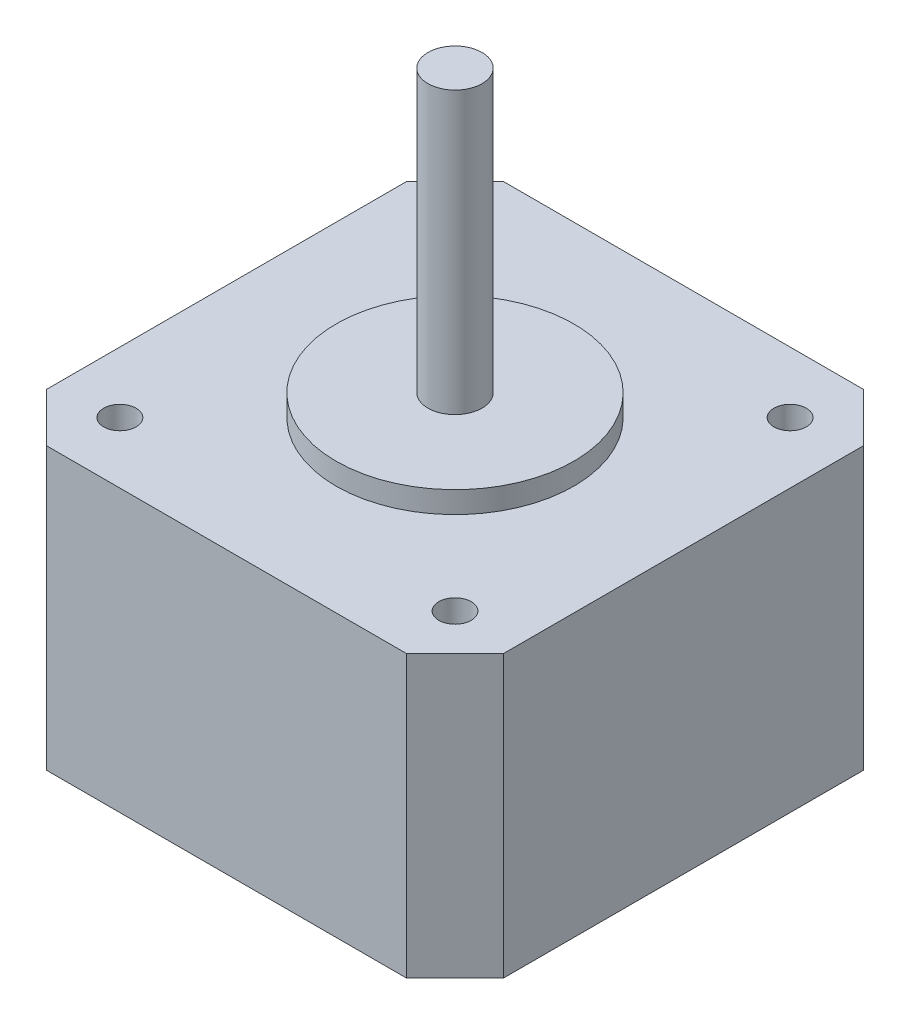
ISO-10303-21;
HEADER;
FILE_DESCRIPTION(('STEP AP214'),'2;1');
FILE_NAME('part.step','',(''),(''),'','','');
FILE_SCHEMA(('AUTOMOTIVE_DESIGN { 1 0 10303 214 1 1 1 1 }'));
ENDSEC;
DATA;
#1=APPLICATION_CONTEXT('core data for automotive mechanical design processes');
#2=APPLICATION_PROTOCOL_DEFINITION('international standard','automotive_design',2000,#1);
#3=PRODUCT_CONTEXT('',#1,'mechanical');
#4=PRODUCT('Part','Part','',(#3));
#5=PRODUCT_RELATED_PRODUCT_CATEGORY('part','',(#4));
#6=PRODUCT_DEFINITION_FORMATION('','',#4);
#7=PRODUCT_DEFINITION_CONTEXT('part definition',#1,'design');
#8=PRODUCT_DEFINITION('design','',#6,#7);
#9=PRODUCT_DEFINITION_SHAPE('','',#8);
#10=(LENGTH_UNIT() NAMED_UNIT(*) SI_UNIT(.MILLI.,.METRE.));
#11=(NAMED_UNIT(*) PLANE_ANGLE_UNIT() SI_UNIT($,.RADIAN.));
#12=(NAMED_UNIT(*) SI_UNIT($,.STERADIAN.) SOLID_ANGLE_UNIT());
#13=UNCERTAINTY_MEASURE_WITH_UNIT(LENGTH_MEASURE(1.E-05),#10,'distance_accuracy_value','');
#14=(GEOMETRIC_REPRESENTATION_CONTEXT(3) GLOBAL_UNCERTAINTY_ASSIGNED_CONTEXT((#13)) GLOBAL_UNIT_ASSIGNED_CONTEXT((#10,
#11,#12)) REPRESENTATION_CONTEXT('',''));
#15=CARTESIAN_POINT('',(0.,0.,0.));
#16=DIRECTION('',(0.,0.,1.));
#17=DIRECTION('',(1.,0.,0.));
#18=AXIS2_PLACEMENT_3D('',#15,#16,#17);
#19=CARTESIAN_POINT('',(0.,26.,-4.5));
#20=DIRECTION('',(1.,0.,0.));
#21=DIRECTION('',(0.,0.,-1.));
#22=AXIS2_PLACEMENT_3D('',#19,#20,#21);
#23=PLANE('',#22);
#24=DIRECTION('',(0.,0.,1.));
#25=VECTOR('',#24,1.);
#26=CARTESIAN_POINT('',(0.,0.,-4.5));
#27=LINE('',#26,#25);
#28=CARTESIAN_POINT('',(0.,0.,-37.8));
#29=VERTEX_POINT('',#28);
#30=CARTESIAN_POINT('',(0.,0.,-4.5));
#31=VERTEX_POINT('',#30);
#32=EDGE_CURVE('E148',#29,#31,#27,.T.);
#33=ORIENTED_EDGE('',*,*,#32,.T.);
#34=DIRECTION('',(0.,-1.,0.));
#35=VECTOR('',#34,1.);
#36=CARTESIAN_POINT('',(0.,26.,-4.5));
#37=LINE('',#36,#35);
#38=CARTESIAN_POINT('',(0.,26.,-4.5));
#39=VERTEX_POINT('',#38);
#40=EDGE_CURVE('E41',#39,#31,#37,.T.);
#41=ORIENTED_EDGE('',*,*,#40,.F.);
#42=DIRECTION('',(0.,0.,1.));
#43=VECTOR('',#42,1.);
#44=CARTESIAN_POINT('',(0.,26.,-4.5));
#45=LINE('',#44,#43);
#46=CARTESIAN_POINT('',(0.,26.,-37.8));
#47=VERTEX_POINT('',#46);
#48=EDGE_CURVE('E168',#47,#39,#45,.T.);
#49=ORIENTED_EDGE('',*,*,#48,.F.);
#50=DIRECTION('',(0.,-1.,0.));
#51=VECTOR('',#50,1.);
#52=CARTESIAN_POINT('',(0.,26.,-37.8));
#53=LINE('',#52,#51);
#54=EDGE_CURVE('E144',#47,#29,#53,.T.);
#55=ORIENTED_EDGE('',*,*,#54,.T.);
#56=EDGE_LOOP('',(#33,#41,#49,#55));
#57=FACE_BOUND('',#56,.T.);
#58=ADVANCED_FACE('F38',(#57),#23,.F.);
#59=CARTESIAN_POINT('',(0.,26.,-4.5));
#60=DIRECTION('',(0.707106781186548,0.,-0.707106781186548));
#61=DIRECTION('',(-0.707106781186548,0.,-0.707106781186548));
#62=AXIS2_PLACEMENT_3D('',#59,#60,#61);
#63=PLANE('',#62);
#64=DIRECTION('',(0.707106781186547,0.,0.707106781186547));
#65=VECTOR('',#64,1.);
#66=CARTESIAN_POINT('',(0.,0.,-4.5));
#67=LINE('',#66,#65);
#68=CARTESIAN_POINT('',(4.5,0.,0.));
#69=VERTEX_POINT('',#68);
#70=EDGE_CURVE('E152',#31,#69,#67,.T.);
#71=ORIENTED_EDGE('',*,*,#70,.T.);
#72=DIRECTION('',(0.,-1.,0.));
#73=VECTOR('',#72,1.);
#74=CARTESIAN_POINT('',(4.5,26.,0.));
#75=LINE('',#74,#73);
#76=CARTESIAN_POINT('',(4.5,26.,0.));
#77=VERTEX_POINT('',#76);
#78=EDGE_CURVE('E178',#77,#69,#75,.T.);
#79=ORIENTED_EDGE('',*,*,#78,.F.);
#80=DIRECTION('',(0.707106781186547,0.,0.707106781186547));
#81=VECTOR('',#80,1.);
#82=CARTESIAN_POINT('',(0.,26.,-4.5));
#83=LINE('',#82,#81);
#84=EDGE_CURVE('E106',#39,#77,#83,.T.);
#85=ORIENTED_EDGE('',*,*,#84,.F.);
#86=ORIENTED_EDGE('',*,*,#40,.T.);
#87=EDGE_LOOP('',(#71,#79,#85,#86));
#88=FACE_BOUND('',#87,.T.);
#89=ADVANCED_FACE('F229',(#88),#63,.F.);
#90=CARTESIAN_POINT('',(4.5,26.,0.));
#91=DIRECTION('',(0.,0.,-1.));
#92=DIRECTION('',(-1.,0.,0.));
#93=AXIS2_PLACEMENT_3D('',#90,#91,#92);
#94=PLANE('',#93);
#95=DIRECTION('',(1.,0.,0.));
#96=VECTOR('',#95,1.);
#97=CARTESIAN_POINT('',(4.5,0.,0.));
#98=LINE('',#97,#96);
#99=CARTESIAN_POINT('',(37.8,0.,0.));
#100=VERTEX_POINT('',#99);
#101=EDGE_CURVE('E156',#69,#100,#98,.T.);
#102=ORIENTED_EDGE('',*,*,#101,.T.);
#103=DIRECTION('',(0.,-1.,0.));
#104=VECTOR('',#103,1.);
#105=CARTESIAN_POINT('',(37.8,26.,0.));
#106=LINE('',#105,#104);
#107=CARTESIAN_POINT('',(37.8,26.,0.));
#108=VERTEX_POINT('',#107);
#109=EDGE_CURVE('E176',#108,#100,#106,.T.);
#110=ORIENTED_EDGE('',*,*,#109,.F.);
#111=DIRECTION('',(1.,0.,0.));
#112=VECTOR('',#111,1.);
#113=CARTESIAN_POINT('',(4.5,26.,0.));
#114=LINE('',#113,#112);
#115=EDGE_CURVE('E199',#77,#108,#114,.T.);
#116=ORIENTED_EDGE('',*,*,#115,.F.);
#117=ORIENTED_EDGE('',*,*,#78,.T.);
#118=EDGE_LOOP('',(#102,#110,#116,#117));
#119=FACE_BOUND('',#118,.T.);
#120=ADVANCED_FACE('F233',(#119),#94,.F.);
#121=CARTESIAN_POINT('',(37.8,26.,0.));
#122=DIRECTION('',(-0.707106781186548,0.,-0.707106781186547));
#123=DIRECTION('',(-0.707106781186547,0.,0.707106781186548));
#124=AXIS2_PLACEMENT_3D('',#121,#122,#123);
#125=PLANE('',#124);
#126=DIRECTION('',(0.707106781186547,0.,-0.707106781186548));
#127=VECTOR('',#126,1.);
#128=CARTESIAN_POINT('',(37.8,0.,0.));
#129=LINE('',#128,#127);
#130=CARTESIAN_POINT('',(42.3,0.,-4.5));
#131=VERTEX_POINT('',#130);
#132=EDGE_CURVE('E159',#100,#131,#129,.T.);
#133=ORIENTED_EDGE('',*,*,#132,.T.);
#134=DIRECTION('',(0.,-1.,0.));
#135=VECTOR('',#134,1.);
#136=CARTESIAN_POINT('',(42.3,26.,-4.5));
#137=LINE('',#136,#135);
#138=CARTESIAN_POINT('',(42.3,26.,-4.5));
#139=VERTEX_POINT('',#138);
#140=EDGE_CURVE('E173',#139,#131,#137,.T.);
#141=ORIENTED_EDGE('',*,*,#140,.F.);
#142=DIRECTION('',(0.707106781186547,0.,-0.707106781186548));
#143=VECTOR('',#142,1.);
#144=CARTESIAN_POINT('',(37.8,26.,0.));
#145=LINE('',#144,#143);
#146=EDGE_CURVE('E202',#108,#139,#145,.T.);
#147=ORIENTED_EDGE('',*,*,#146,.F.);
#148=ORIENTED_EDGE('',*,*,#109,.T.);
#149=EDGE_LOOP('',(#133,#141,#147,#148));
#150=FACE_BOUND('',#149,.T.);
#151=ADVANCED_FACE('F207',(#150),#125,.F.);
#152=CARTESIAN_POINT('',(42.3,26.,-4.5));
#153=DIRECTION('',(-1.,0.,0.));
#154=DIRECTION('',(0.,0.,1.));
#155=AXIS2_PLACEMENT_3D('',#152,#153,#154);
#156=PLANE('',#155);
#157=DIRECTION('',(0.,0.,-1.));
#158=VECTOR('',#157,1.);
#159=CARTESIAN_POINT('',(42.3,0.,-4.5));
#160=LINE('',#159,#158);
#161=CARTESIAN_POINT('',(42.3,0.,-37.8));
#162=VERTEX_POINT('',#161);
#163=EDGE_CURVE('E161',#131,#162,#160,.T.);
#164=ORIENTED_EDGE('',*,*,#163,.T.);
#165=DIRECTION('',(0.,-1.,0.));
#166=VECTOR('',#165,1.);
#167=CARTESIAN_POINT('',(42.3,26.,-37.8));
#168=LINE('',#167,#166);
#169=CARTESIAN_POINT('',(42.3,26.,-37.8));
#170=VERTEX_POINT('',#169);
#171=EDGE_CURVE('E135',#170,#162,#168,.T.);
#172=ORIENTED_EDGE('',*,*,#171,.F.);
#173=DIRECTION('',(0.,0.,-1.));
#174=VECTOR('',#173,1.);
#175=CARTESIAN_POINT('',(42.3,26.,-4.5));
#176=LINE('',#175,#174);
#177=EDGE_CURVE('E126',#139,#170,#176,.T.);
#178=ORIENTED_EDGE('',*,*,#177,.F.);
#179=ORIENTED_EDGE('',*,*,#140,.T.);
#180=EDGE_LOOP('',(#164,#172,#178,#179));
#181=FACE_BOUND('',#180,.T.);
#182=ADVANCED_FACE('F211',(#181),#156,.F.);
#183=CARTESIAN_POINT('',(37.8,26.,-42.3));
#184=DIRECTION('',(-0.707106781186548,0.,0.707106781186548));
#185=DIRECTION('',(0.707106781186548,0.,0.707106781186548));
#186=AXIS2_PLACEMENT_3D('',#183,#184,#185);
#187=PLANE('',#186);
#188=DIRECTION('',(-0.707106781186548,0.,-0.707106781186548));
#189=VECTOR('',#188,1.);
#190=CARTESIAN_POINT('',(37.8,0.,-42.3));
#191=LINE('',#190,#189);
#192=CARTESIAN_POINT('',(37.8,0.,-42.3));
#193=VERTEX_POINT('',#192);
#194=EDGE_CURVE('E134',#162,#193,#191,.T.);
#195=ORIENTED_EDGE('',*,*,#194,.T.);
#196=DIRECTION('',(0.,-1.,0.));
#197=VECTOR('',#196,1.);
#198=CARTESIAN_POINT('',(37.8,26.,-42.3));
#199=LINE('',#198,#197);
#200=CARTESIAN_POINT('',(37.8,26.,-42.3));
#201=VERTEX_POINT('',#200);
#202=EDGE_CURVE('E131',#201,#193,#199,.T.);
#203=ORIENTED_EDGE('',*,*,#202,.F.);
#204=DIRECTION('',(-0.707106781186548,0.,-0.707106781186548));
#205=VECTOR('',#204,1.);
#206=CARTESIAN_POINT('',(37.8,26.,-42.3));
#207=LINE('',#206,#205);
#208=EDGE_CURVE('E120',#170,#201,#207,.T.);
#209=ORIENTED_EDGE('',*,*,#208,.F.);
#210=ORIENTED_EDGE('',*,*,#171,.T.);
#211=EDGE_LOOP('',(#195,#203,#209,#210));
#212=FACE_BOUND('',#211,.T.);
#213=ADVANCED_FACE('F132',(#212),#187,.F.);
#214=CARTESIAN_POINT('',(4.5,26.,-42.3));
#215=DIRECTION('',(0.,0.,1.));
#216=DIRECTION('',(1.,0.,0.));
#217=AXIS2_PLACEMENT_3D('',#214,#215,#216);
#218=PLANE('',#217);
#219=DIRECTION('',(-1.,0.,0.));
#220=VECTOR('',#219,1.);
#221=CARTESIAN_POINT('',(4.5,0.,-42.3));
#222=LINE('',#221,#220);
#223=CARTESIAN_POINT('',(4.5,0.,-42.3));
#224=VERTEX_POINT('',#223);
#225=EDGE_CURVE('E91',#193,#224,#222,.T.);
#226=ORIENTED_EDGE('',*,*,#225,.T.);
#227=DIRECTION('',(0.,-1.,0.));
#228=VECTOR('',#227,1.);
#229=CARTESIAN_POINT('',(4.5,26.,-42.3));
#230=LINE('',#229,#228);
#231=CARTESIAN_POINT('',(4.5,26.,-42.3));
#232=VERTEX_POINT('',#231);
#233=EDGE_CURVE('E136',#232,#224,#230,.T.);
#234=ORIENTED_EDGE('',*,*,#233,.F.);
#235=DIRECTION('',(-1.,0.,0.));
#236=VECTOR('',#235,1.);
#237=CARTESIAN_POINT('',(4.5,26.,-42.3));
#238=LINE('',#237,#236);
#239=EDGE_CURVE('E124',#201,#232,#238,.T.);
#240=ORIENTED_EDGE('',*,*,#239,.F.);
#241=ORIENTED_EDGE('',*,*,#202,.T.);
#242=EDGE_LOOP('',(#226,#234,#240,#241));
#243=FACE_BOUND('',#242,.T.);
#244=ADVANCED_FACE('F138',(#243),#218,.F.);
#245=CARTESIAN_POINT('',(0.,26.,-37.8));
#246=DIRECTION('',(0.707106781186547,0.,0.707106781186548));
#247=DIRECTION('',(0.707106781186548,0.,-0.707106781186547));
#248=AXIS2_PLACEMENT_3D('',#245,#246,#247);
#249=PLANE('',#248);
#250=DIRECTION('',(-0.707106781186548,0.,0.707106781186547));
#251=VECTOR('',#250,1.);
#252=CARTESIAN_POINT('',(0.,0.,-37.8));
#253=LINE('',#252,#251);
#254=EDGE_CURVE('E97',#224,#29,#253,.T.);
#255=ORIENTED_EDGE('',*,*,#254,.T.);
#256=ORIENTED_EDGE('',*,*,#54,.F.);
#257=DIRECTION('',(-0.707106781186548,0.,0.707106781186547));
#258=VECTOR('',#257,1.);
#259=CARTESIAN_POINT('',(0.,26.,-37.8));
#260=LINE('',#259,#258);
#261=EDGE_CURVE('E59',#232,#47,#260,.T.);
#262=ORIENTED_EDGE('',*,*,#261,.F.);
#263=ORIENTED_EDGE('',*,*,#233,.T.);
#264=EDGE_LOOP('',(#255,#256,#262,#263));
#265=FACE_BOUND('',#264,.T.);
#266=ADVANCED_FACE('F217',(#265),#249,.F.);
#267=CARTESIAN_POINT('',(0.,26.,0.));
#268=DIRECTION('',(0.,-1.,0.));
#269=DIRECTION('',(0.,0.,-1.));
#270=AXIS2_PLACEMENT_3D('',#267,#268,#269);
#271=PLANE('',#270);
#272=CARTESIAN_POINT('',(36.65,26.,-36.65));
#273=DIRECTION('',(0.,1.,0.));
#274=DIRECTION('',(0.,0.,1.));
#275=AXIS2_PLACEMENT_3D('',#272,#273,#274);
#276=CIRCLE('',#275,1.5);
#277=CARTESIAN_POINT('',(36.65,26.,-35.15));
#278=VERTEX_POINT('',#277);
#279=EDGE_CURVE('E408',#278,#278,#276,.T.);
#280=ORIENTED_EDGE('',*,*,#279,.F.);
#281=EDGE_LOOP('',(#280));
#282=FACE_BOUND('',#281,.T.);
#283=CARTESIAN_POINT('',(5.65,26.,-5.65));
#284=DIRECTION('',(0.,1.,0.));
#285=DIRECTION('',(0.,0.,-1.));
#286=AXIS2_PLACEMENT_3D('',#283,#284,#285);
#287=CIRCLE('',#286,1.5);
#288=CARTESIAN_POINT('',(5.65,26.,-7.15));
#289=VERTEX_POINT('',#288);
#290=EDGE_CURVE('E400',#289,#289,#287,.T.);
#291=ORIENTED_EDGE('',*,*,#290,.F.);
#292=EDGE_LOOP('',(#291));
#293=FACE_BOUND('',#292,.T.);
#294=CARTESIAN_POINT('',(36.65,26.,-5.65));
#295=DIRECTION('',(0.,1.,0.));
#296=DIRECTION('',(0.,0.,-1.));
#297=AXIS2_PLACEMENT_3D('',#294,#295,#296);
#298=CIRCLE('',#297,1.5);
#299=CARTESIAN_POINT('',(36.65,26.,-7.15));
#300=VERTEX_POINT('',#299);
#301=EDGE_CURVE('E412',#300,#300,#298,.T.);
#302=ORIENTED_EDGE('',*,*,#301,.F.);
#303=EDGE_LOOP('',(#302));
#304=FACE_BOUND('',#303,.T.);
#305=CARTESIAN_POINT('',(5.65,26.,-36.65));
#306=DIRECTION('',(0.,1.,0.));
#307=DIRECTION('',(0.,0.,1.));
#308=AXIS2_PLACEMENT_3D('',#305,#306,#307);
#309=CIRCLE('',#308,1.5);
#310=CARTESIAN_POINT('',(5.65,26.,-35.15));
#311=VERTEX_POINT('',#310);
#312=EDGE_CURVE('E394',#311,#311,#309,.T.);
#313=ORIENTED_EDGE('',*,*,#312,.F.);
#314=EDGE_LOOP('',(#313));
#315=FACE_BOUND('',#314,.T.);
#316=CARTESIAN_POINT('',(21.15,26.,-21.15));
#317=DIRECTION('',(0.,1.,0.));
#318=DIRECTION('',(0.,0.,1.));
#319=AXIS2_PLACEMENT_3D('',#316,#317,#318);
#320=CIRCLE('',#319,11.);
#321=CARTESIAN_POINT('',(21.15,26.,-10.15));
#322=VERTEX_POINT('',#321);
#323=EDGE_CURVE('E47',#322,#322,#320,.T.);
#324=ORIENTED_EDGE('',*,*,#323,.F.);
#325=EDGE_LOOP('',(#324));
#326=FACE_BOUND('',#325,.T.);
#327=ORIENTED_EDGE('',*,*,#48,.T.);
#328=ORIENTED_EDGE('',*,*,#84,.T.);
#329=ORIENTED_EDGE('',*,*,#115,.T.);
#330=ORIENTED_EDGE('',*,*,#146,.T.);
#331=ORIENTED_EDGE('',*,*,#177,.T.);
#332=ORIENTED_EDGE('',*,*,#208,.T.);
#333=ORIENTED_EDGE('',*,*,#239,.T.);
#334=ORIENTED_EDGE('',*,*,#261,.T.);
#335=EDGE_LOOP('',(#327,#328,#329,#330,#331,#332,#333,#334));
#336=FACE_BOUND('',#335,.T.);
#337=ADVANCED_FACE('F122',(#282,#293,#304,#315,#326,#336),#271,.F.);
#338=CARTESIAN_POINT('',(0.,0.,0.));
#339=DIRECTION('',(0.,-1.,0.));
#340=DIRECTION('',(0.,0.,-1.));
#341=AXIS2_PLACEMENT_3D('',#338,#339,#340);
#342=PLANE('',#341);
#343=ORIENTED_EDGE('',*,*,#32,.F.);
#344=ORIENTED_EDGE('',*,*,#254,.F.);
#345=ORIENTED_EDGE('',*,*,#225,.F.);
#346=ORIENTED_EDGE('',*,*,#194,.F.);
#347=ORIENTED_EDGE('',*,*,#163,.F.);
#348=ORIENTED_EDGE('',*,*,#132,.F.);
#349=ORIENTED_EDGE('',*,*,#101,.F.);
#350=ORIENTED_EDGE('',*,*,#70,.F.);
#351=EDGE_LOOP('',(#343,#344,#345,#346,#347,#348,#349,#350));
#352=FACE_BOUND('',#351,.T.);
#353=ADVANCED_FACE('F214',(#352),#342,.T.);
#354=CARTESIAN_POINT('',(21.15,28.,-21.15));
#355=DIRECTION('',(0.,-1.,0.));
#356=DIRECTION('',(0.,0.,-1.));
#357=AXIS2_PLACEMENT_3D('',#354,#355,#356);
#358=CYLINDRICAL_SURFACE('',#357,11.);
#359=CARTESIAN_POINT('',(21.15,28.,-21.15));
#360=DIRECTION('',(0.,1.,0.));
#361=DIRECTION('',(0.,0.,1.));
#362=AXIS2_PLACEMENT_3D('',#359,#360,#361);
#363=CIRCLE('',#362,11.);
#364=CARTESIAN_POINT('',(21.15,28.,-10.15));
#365=VERTEX_POINT('',#364);
#366=EDGE_CURVE('E153',#365,#365,#363,.T.);
#367=ORIENTED_EDGE('',*,*,#366,.F.);
#368=EDGE_LOOP('',(#367));
#369=FACE_BOUND('',#368,.T.);
#370=ORIENTED_EDGE('',*,*,#323,.T.);
#371=EDGE_LOOP('',(#370));
#372=FACE_BOUND('',#371,.T.);
#373=ADVANCED_FACE('F259',(#369,#372),#358,.T.);
#374=CARTESIAN_POINT('',(21.15,28.,-21.15));
#375=DIRECTION('',(0.,1.,0.));
#376=DIRECTION('',(0.,0.,1.));
#377=AXIS2_PLACEMENT_3D('',#374,#375,#376);
#378=PLANE('',#377);
#379=CARTESIAN_POINT('',(21.15,28.,-21.15));
#380=DIRECTION('',(0.,1.,0.));
#381=DIRECTION('',(0.,0.,1.));
#382=AXIS2_PLACEMENT_3D('',#379,#380,#381);
#383=CIRCLE('',#382,2.5);
#384=CARTESIAN_POINT('',(21.15,28.,-23.65));
#385=VERTEX_POINT('',#384);
#386=EDGE_CURVE('E11',#385,#385,#383,.T.);
#387=ORIENTED_EDGE('',*,*,#386,.F.);
#388=EDGE_LOOP('',(#387));
#389=FACE_BOUND('',#388,.T.);
#390=ORIENTED_EDGE('',*,*,#366,.T.);
#391=EDGE_LOOP('',(#390));
#392=FACE_BOUND('',#391,.T.);
#393=ADVANCED_FACE('F377',(#389,#392),#378,.T.);
#394=CARTESIAN_POINT('',(21.15,54.,-21.15));
#395=DIRECTION('',(0.,-1.,0.));
#396=DIRECTION('',(0.,0.,-1.));
#397=AXIS2_PLACEMENT_3D('',#394,#395,#396);
#398=CYLINDRICAL_SURFACE('',#397,2.5);
#399=CARTESIAN_POINT('',(21.15,54.,-21.15));
#400=DIRECTION('',(0.,1.,0.));
#401=DIRECTION('',(0.,0.,1.));
#402=AXIS2_PLACEMENT_3D('',#399,#400,#401);
#403=CIRCLE('',#402,2.5);
#404=CARTESIAN_POINT('',(21.15,54.,-23.65));
#405=VERTEX_POINT('',#404);
#406=EDGE_CURVE('E387',#405,#405,#403,.T.);
#407=CARTESIAN_POINT('',(21.15,54.,-23.65));
#408=CARTESIAN_POINT('',(21.15,53.7291666666667,-23.65));
#409=CARTESIAN_POINT('',(21.15,53.4583333333333,-23.65));
#410=CARTESIAN_POINT('',(21.15,52.9166666666667,-23.65));
#411=CARTESIAN_POINT('',(21.15,52.6458333333333,-23.65));
#412=CARTESIAN_POINT('',(21.15,52.1041666666667,-23.65));
#413=CARTESIAN_POINT('',(21.15,51.8333333333333,-23.65));
#414=CARTESIAN_POINT('',(21.15,51.2916666666667,-23.65));
#415=CARTESIAN_POINT('',(21.15,51.0208333333333,-23.65));
#416=CARTESIAN_POINT('',(21.15,50.4791666666667,-23.65));
#417=CARTESIAN_POINT('',(21.15,50.2083333333333,-23.65));
#418=CARTESIAN_POINT('',(21.15,49.6666666666667,-23.65));
#419=CARTESIAN_POINT('',(21.15,49.3958333333333,-23.65));
#420=CARTESIAN_POINT('',(21.15,48.8541666666667,-23.65));
#421=CARTESIAN_POINT('',(21.15,48.5833333333333,-23.65));
#422=CARTESIAN_POINT('',(21.15,48.0416666666667,-23.65));
#423=CARTESIAN_POINT('',(21.15,47.7708333333333,-23.65));
#424=CARTESIAN_POINT('',(21.15,47.2291666666667,-23.65));
#425=CARTESIAN_POINT('',(21.15,46.9583333333333,-23.65));
#426=CARTESIAN_POINT('',(21.15,46.4166666666667,-23.65));
#427=CARTESIAN_POINT('',(21.15,46.1458333333333,-23.65));
#428=CARTESIAN_POINT('',(21.15,45.6041666666667,-23.65));
#429=CARTESIAN_POINT('',(21.15,45.3333333333333,-23.65));
#430=CARTESIAN_POINT('',(21.15,44.7916666666667,-23.65));
#431=CARTESIAN_POINT('',(21.15,44.5208333333333,-23.65));
#432=CARTESIAN_POINT('',(21.15,43.9791666666667,-23.65));
#433=CARTESIAN_POINT('',(21.15,43.7083333333333,-23.65));
#434=CARTESIAN_POINT('',(21.15,43.1666666666667,-23.65));
#435=CARTESIAN_POINT('',(21.15,42.8958333333333,-23.65));
#436=CARTESIAN_POINT('',(21.15,42.3541666666667,-23.65));
#437=CARTESIAN_POINT('',(21.15,42.0833333333333,-23.65));
#438=CARTESIAN_POINT('',(21.15,41.5416666666667,-23.65));
#439=CARTESIAN_POINT('',(21.15,41.2708333333333,-23.65));
#440=CARTESIAN_POINT('',(21.15,40.7291666666667,-23.65));
#441=CARTESIAN_POINT('',(21.15,40.4583333333333,-23.65));
#442=CARTESIAN_POINT('',(21.15,39.9166666666667,-23.65));
#443=CARTESIAN_POINT('',(21.15,39.6458333333333,-23.65));
#444=CARTESIAN_POINT('',(21.15,39.1041666666667,-23.65));
#445=CARTESIAN_POINT('',(21.15,38.8333333333333,-23.65));
#446=CARTESIAN_POINT('',(21.15,38.2916666666667,-23.65));
#447=CARTESIAN_POINT('',(21.15,38.0208333333333,-23.65));
#448=CARTESIAN_POINT('',(21.15,37.4791666666667,-23.65));
#449=CARTESIAN_POINT('',(21.15,37.2083333333333,-23.65));
#450=CARTESIAN_POINT('',(21.15,36.6666666666667,-23.65));
#451=CARTESIAN_POINT('',(21.15,36.3958333333333,-23.65));
#452=CARTESIAN_POINT('',(21.15,35.8541666666667,-23.65));
#453=CARTESIAN_POINT('',(21.15,35.5833333333333,-23.65));
#454=CARTESIAN_POINT('',(21.15,35.0416666666667,-23.65));
#455=CARTESIAN_POINT('',(21.15,34.7708333333333,-23.65));
#456=CARTESIAN_POINT('',(21.15,34.2291666666667,-23.65));
#457=CARTESIAN_POINT('',(21.15,33.9583333333333,-23.65));
#458=CARTESIAN_POINT('',(21.15,33.4166666666667,-23.65));
#459=CARTESIAN_POINT('',(21.15,33.1458333333333,-23.65));
#460=CARTESIAN_POINT('',(21.15,32.6041666666667,-23.65));
#461=CARTESIAN_POINT('',(21.15,32.3333333333333,-23.65));
#462=CARTESIAN_POINT('',(21.15,31.7916666666667,-23.65));
#463=CARTESIAN_POINT('',(21.15,31.5208333333333,-23.65));
#464=CARTESIAN_POINT('',(21.15,30.9791666666667,-23.65));
#465=CARTESIAN_POINT('',(21.15,30.7083333333333,-23.65));
#466=CARTESIAN_POINT('',(21.15,30.1666666666667,-23.65));
#467=CARTESIAN_POINT('',(21.15,29.8958333333333,-23.65));
#468=CARTESIAN_POINT('',(21.15,29.3541666666667,-23.65));
#469=CARTESIAN_POINT('',(21.15,29.0833333333333,-23.65));
#470=CARTESIAN_POINT('',(21.15,28.5416666666667,-23.65));
#471=CARTESIAN_POINT('',(21.15,28.2708333333333,-23.65));
#472=CARTESIAN_POINT('',(21.15,28.,-23.65));
#473=B_SPLINE_CURVE_WITH_KNOTS('',3,(#407,#408,#409,#410,#411,#412,#413,#414,#415,#416,#417,
#418,#419,#420,#421,#422,#423,#424,#425,#426,#427,#428,#429,#430,#431,#432,#433,#434,#435,#436,
#437,#438,#439,#440,#441,#442,#443,#444,#445,#446,#447,#448,#449,#450,#451,#452,#453,#454,#455,
#456,#457,#458,#459,#460,#461,#462,#463,#464,#465,#466,#467,#468,#469,#470,#471,#472),
.UNSPECIFIED.,.F.,.F.,(4,2,2,2,2,2,2,2,2,2,2,2,2,2,2,2,2,2,2,2,2,2,2,2,2,2,2,2,2,2,2,2,4),(0.,
0.812499999999994,1.62499999999999,2.4375,3.25,4.0625,4.875,5.6875,6.5,7.31249999999999,
8.12499999999999,8.93749999999999,9.74999999999999,10.5625,11.375,12.1875,13.,13.8125,14.625,
15.4375,16.25,17.0625,17.875,18.6875,19.5,20.3125,21.125,21.9375,22.75,23.5625,24.375,25.1875,
26.),.UNSPECIFIED.);
#474=EDGE_CURVE('BSEAM373',#405,#385,#473,.T.);
#475=ORIENTED_EDGE('',*,*,#406,.F.);
#476=ORIENTED_EDGE('',*,*,#386,.T.);
#477=ORIENTED_EDGE('',*,*,#474,.T.);
#478=ORIENTED_EDGE('',*,*,#474,.F.);
#479=EDGE_LOOP('',(#475,#477,#476,#478));
#480=FACE_BOUND('',#479,.T.);
#481=ADVANCED_FACE('F373',(#480),#398,.T.);
#482=CARTESIAN_POINT('',(21.15,54.,-21.15));
#483=DIRECTION('',(0.,1.,0.));
#484=DIRECTION('',(0.,0.,1.));
#485=AXIS2_PLACEMENT_3D('',#482,#483,#484);
#486=PLANE('',#485);
#487=ORIENTED_EDGE('',*,*,#406,.T.);
#488=EDGE_LOOP('',(#487));
#489=FACE_BOUND('',#488,.T.);
#490=ADVANCED_FACE('F286',(#489),#486,.T.);
#491=CARTESIAN_POINT('',(5.65,21.5,-36.65));
#492=DIRECTION('',(0.,1.,0.));
#493=DIRECTION('',(0.,0.,1.));
#494=AXIS2_PLACEMENT_3D('',#491,#492,#493);
#495=CYLINDRICAL_SURFACE('',#494,1.5);
#496=CARTESIAN_POINT('',(5.65,21.5,-36.65));
#497=DIRECTION('',(0.,1.,0.));
#498=DIRECTION('',(0.,0.,1.));
#499=AXIS2_PLACEMENT_3D('',#496,#497,#498);
#500=CIRCLE('',#499,1.5);
#501=CARTESIAN_POINT('',(5.65,21.5,-35.15));
#502=VERTEX_POINT('',#501);
#503=EDGE_CURVE('E390',#502,#502,#500,.T.);
#504=ORIENTED_EDGE('',*,*,#503,.F.);
#505=EDGE_LOOP('',(#504));
#506=FACE_BOUND('',#505,.T.);
#507=ORIENTED_EDGE('',*,*,#312,.T.);
#508=EDGE_LOOP('',(#507));
#509=FACE_BOUND('',#508,.T.);
#510=ADVANCED_FACE('F291',(#506,#509),#495,.F.);
#511=CARTESIAN_POINT('',(5.65,21.5,-36.65));
#512=DIRECTION('',(0.,1.,0.));
#513=DIRECTION('',(0.,0.,1.));
#514=AXIS2_PLACEMENT_3D('',#511,#512,#513);
#515=PLANE('',#514);
#516=ORIENTED_EDGE('',*,*,#503,.T.);
#517=EDGE_LOOP('',(#516));
#518=FACE_BOUND('',#517,.T.);
#519=ADVANCED_FACE('F296',(#518),#515,.T.);
#520=CARTESIAN_POINT('',(36.65,21.5,-5.65));
#521=DIRECTION('',(0.,1.,0.));
#522=DIRECTION('',(0.,0.,1.));
#523=AXIS2_PLACEMENT_3D('',#520,#521,#522);
#524=CYLINDRICAL_SURFACE('',#523,1.5);
#525=CARTESIAN_POINT('',(36.65,21.5,-5.65));
#526=DIRECTION('',(0.,1.,0.));
#527=DIRECTION('',(0.,0.,-1.));
#528=AXIS2_PLACEMENT_3D('',#525,#526,#527);
#529=CIRCLE('',#528,1.5);
#530=CARTESIAN_POINT('',(36.65,21.5,-7.15));
#531=VERTEX_POINT('',#530);
#532=EDGE_CURVE('E405',#531,#531,#529,.T.);
#533=ORIENTED_EDGE('',*,*,#532,.F.);
#534=EDGE_LOOP('',(#533));
#535=FACE_BOUND('',#534,.T.);
#536=ORIENTED_EDGE('',*,*,#301,.T.);
#537=EDGE_LOOP('',(#536));
#538=FACE_BOUND('',#537,.T.);
#539=ADVANCED_FACE('F306',(#535,#538),#524,.F.);
#540=CARTESIAN_POINT('',(36.65,21.5,-5.65));
#541=DIRECTION('',(0.,-1.,0.));
#542=DIRECTION('',(0.,0.,-1.));
#543=AXIS2_PLACEMENT_3D('',#540,#541,#542);
#544=PLANE('',#543);
#545=ORIENTED_EDGE('',*,*,#532,.T.);
#546=EDGE_LOOP('',(#545));
#547=FACE_BOUND('',#546,.T.);
#548=ADVANCED_FACE('F316',(#547),#544,.F.);
#549=CARTESIAN_POINT('',(5.65,21.5,-5.65));
#550=DIRECTION('',(0.,1.,0.));
#551=DIRECTION('',(0.,0.,1.));
#552=AXIS2_PLACEMENT_3D('',#549,#550,#551);
#553=CYLINDRICAL_SURFACE('',#552,1.5);
#554=CARTESIAN_POINT('',(5.65,21.5,-5.65));
#555=DIRECTION('',(0.,1.,0.));
#556=DIRECTION('',(0.,0.,-1.));
#557=AXIS2_PLACEMENT_3D('',#554,#555,#556);
#558=CIRCLE('',#557,1.5);
#559=CARTESIAN_POINT('',(5.65,21.5,-7.15));
#560=VERTEX_POINT('',#559);
#561=EDGE_CURVE('E404',#560,#560,#558,.T.);
#562=ORIENTED_EDGE('',*,*,#561,.F.);
#563=EDGE_LOOP('',(#562));
#564=FACE_BOUND('',#563,.T.);
#565=ORIENTED_EDGE('',*,*,#290,.T.);
#566=EDGE_LOOP('',(#565));
#567=FACE_BOUND('',#566,.T.);
#568=ADVANCED_FACE('F326',(#564,#567),#553,.F.);
#569=CARTESIAN_POINT('',(5.65,21.5,-5.65));
#570=DIRECTION('',(0.,-1.,0.));
#571=DIRECTION('',(0.,0.,-1.));
#572=AXIS2_PLACEMENT_3D('',#569,#570,#571);
#573=PLANE('',#572);
#574=ORIENTED_EDGE('',*,*,#561,.T.);
#575=EDGE_LOOP('',(#574));
#576=FACE_BOUND('',#575,.T.);
#577=ADVANCED_FACE('F336',(#576),#573,.F.);
#578=CARTESIAN_POINT('',(36.65,21.5,-36.65));
#579=DIRECTION('',(0.,1.,0.));
#580=DIRECTION('',(0.,0.,1.));
#581=AXIS2_PLACEMENT_3D('',#578,#579,#580);
#582=CYLINDRICAL_SURFACE('',#581,1.5);
#583=CARTESIAN_POINT('',(36.65,21.5,-36.65));
#584=DIRECTION('',(0.,1.,0.));
#585=DIRECTION('',(0.,0.,1.));
#586=AXIS2_PLACEMENT_3D('',#583,#584,#585);
#587=CIRCLE('',#586,1.5);
#588=CARTESIAN_POINT('',(36.65,21.5,-35.15));
#589=VERTEX_POINT('',#588);
#590=EDGE_CURVE('E398',#589,#589,#587,.T.);
#591=ORIENTED_EDGE('',*,*,#590,.F.);
#592=EDGE_LOOP('',(#591));
#593=FACE_BOUND('',#592,.T.);
#594=ORIENTED_EDGE('',*,*,#279,.T.);
#595=EDGE_LOOP('',(#594));
#596=FACE_BOUND('',#595,.T.);
#597=ADVANCED_FACE('F346',(#593,#596),#582,.F.);
#598=CARTESIAN_POINT('',(36.65,21.5,-36.65));
#599=DIRECTION('',(0.,1.,0.));
#600=DIRECTION('',(0.,0.,1.));
#601=AXIS2_PLACEMENT_3D('',#598,#599,#600);
#602=PLANE('',#601);
#603=ORIENTED_EDGE('',*,*,#590,.T.);
#604=EDGE_LOOP('',(#603));
#605=FACE_BOUND('',#604,.T.);
#606=ADVANCED_FACE('F356',(#605),#602,.T.);
#607=CLOSED_SHELL('',(#58,#89,#120,#151,#182,#213,#244,#266,#337,#353,#373,#393,#481,#490,#510,
#519,#539,#548,#568,#577,#597,#606));
#608=MANIFOLD_SOLID_BREP('B2',#607);
#609=ADVANCED_BREP_SHAPE_REPRESENTATION('',(#18,#608),#14);
#610=SHAPE_DEFINITION_REPRESENTATION(#9,#609);
ENDSEC;
END-ISO-10303-21;
